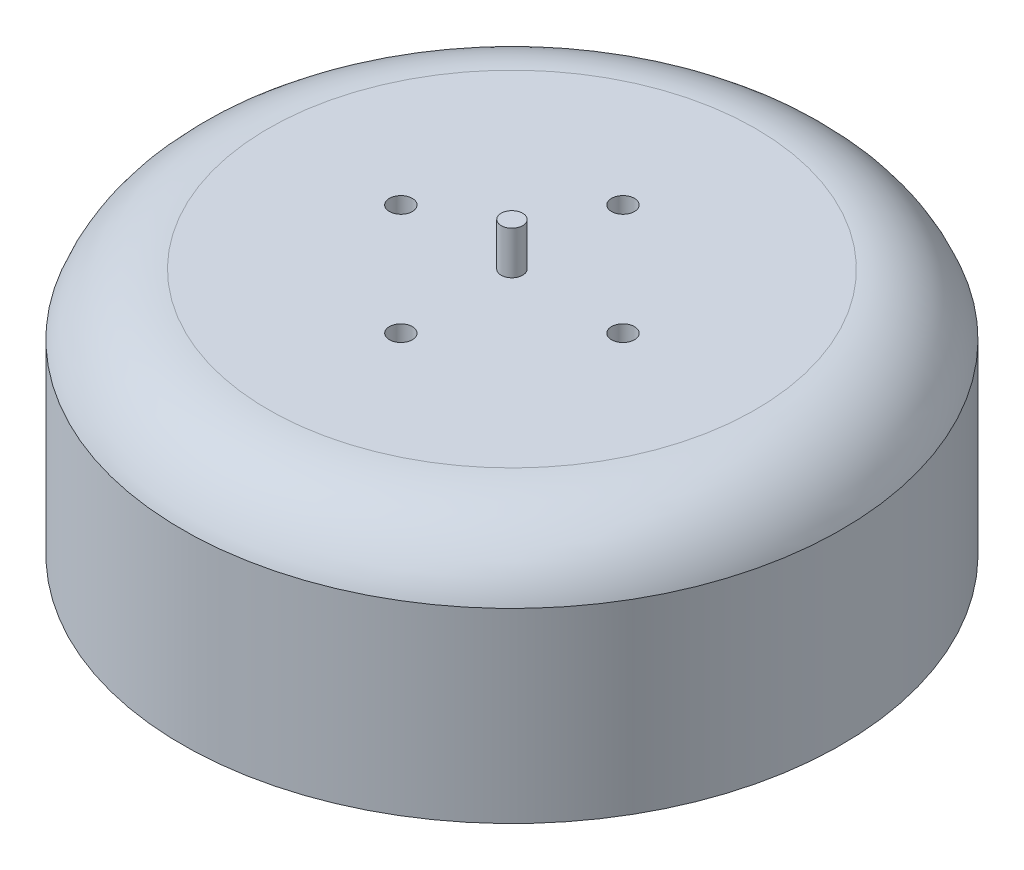
ISO-10303-21;
HEADER;
FILE_DESCRIPTION(('STEP AP214'),'2;1');
FILE_NAME('part.step','',(''),(''),'','','');
FILE_SCHEMA(('AUTOMOTIVE_DESIGN { 1 0 10303 214 1 1 1 1 }'));
ENDSEC;
DATA;
#1=APPLICATION_CONTEXT('core data for automotive mechanical design processes');
#2=APPLICATION_PROTOCOL_DEFINITION('international standard','automotive_design',2000,#1);
#3=PRODUCT_CONTEXT('',#1,'mechanical');
#4=PRODUCT('Part','Part','',(#3));
#5=PRODUCT_RELATED_PRODUCT_CATEGORY('part','',(#4));
#6=PRODUCT_DEFINITION_FORMATION('','',#4);
#7=PRODUCT_DEFINITION_CONTEXT('part definition',#1,'design');
#8=PRODUCT_DEFINITION('design','',#6,#7);
#9=PRODUCT_DEFINITION_SHAPE('','',#8);
#10=(LENGTH_UNIT() NAMED_UNIT(*) SI_UNIT(.MILLI.,.METRE.));
#11=(NAMED_UNIT(*) PLANE_ANGLE_UNIT() SI_UNIT($,.RADIAN.));
#12=(NAMED_UNIT(*) SI_UNIT($,.STERADIAN.) SOLID_ANGLE_UNIT());
#13=UNCERTAINTY_MEASURE_WITH_UNIT(LENGTH_MEASURE(1.E-05),#10,'distance_accuracy_value','');
#14=(GEOMETRIC_REPRESENTATION_CONTEXT(3) GLOBAL_UNCERTAINTY_ASSIGNED_CONTEXT((#13)) GLOBAL_UNIT_ASSIGNED_CONTEXT((#10,
#11,#12)) REPRESENTATION_CONTEXT('',''));
#15=CARTESIAN_POINT('',(0.,0.,0.));
#16=DIRECTION('',(0.,0.,1.));
#17=DIRECTION('',(1.,0.,0.));
#18=AXIS2_PLACEMENT_3D('',#15,#16,#17);
#19=CARTESIAN_POINT('',(0.,25.7794117647059,0.));
#20=DIRECTION('',(0.,-1.,0.));
#21=DIRECTION('',(0.,0.,-1.));
#22=AXIS2_PLACEMENT_3D('',#19,#20,#21);
#23=TOROIDAL_SURFACE('',#22,34.,12.7205882352941);
#24=CARTESIAN_POINT('',(0.,38.5,0.));
#25=DIRECTION('',(0.,-1.,0.));
#26=DIRECTION('',(0.,0.,-1.));
#27=AXIS2_PLACEMENT_3D('',#24,#25,#26);
#28=CIRCLE('',#27,34.);
#29=CARTESIAN_POINT('',(0.,38.5,-34.));
#30=VERTEX_POINT('',#29);
#31=EDGE_CURVE('E53',#30,#30,#28,.T.);
#32=ORIENTED_EDGE('',*,*,#31,.T.);
#33=EDGE_LOOP('',(#32));
#34=FACE_BOUND('',#33,.T.);
#35=CARTESIAN_POINT('',(0.,30.,0.));
#36=DIRECTION('',(0.,-1.,0.));
#37=DIRECTION('',(0.,0.,-1.));
#38=AXIS2_PLACEMENT_3D('',#35,#36,#37);
#39=CIRCLE('',#38,46.);
#40=CARTESIAN_POINT('',(0.,30.,-46.));
#41=VERTEX_POINT('',#40);
#42=EDGE_CURVE('E58',#41,#41,#39,.T.);
#43=ORIENTED_EDGE('',*,*,#42,.F.);
#44=EDGE_LOOP('',(#43));
#45=FACE_BOUND('',#44,.T.);
#46=ADVANCED_FACE('F37',(#34,#45),#23,.T.);
#47=CARTESIAN_POINT('',(34.,38.5,0.));
#48=DIRECTION('',(0.,1.,0.));
#49=DIRECTION('',(0.,0.,1.));
#50=AXIS2_PLACEMENT_3D('',#47,#48,#49);
#51=PLANE('',#50);
#52=CARTESIAN_POINT('',(0.,38.5,-15.5));
#53=DIRECTION('',(0.,1.,0.));
#54=DIRECTION('',(0.,0.,1.));
#55=AXIS2_PLACEMENT_3D('',#52,#53,#54);
#56=CIRCLE('',#55,1.59999999999999);
#57=CARTESIAN_POINT('',(0.,38.5,-13.9));
#58=VERTEX_POINT('',#57);
#59=EDGE_CURVE('E91',#58,#58,#56,.T.);
#60=ORIENTED_EDGE('',*,*,#59,.F.);
#61=EDGE_LOOP('',(#60));
#62=FACE_BOUND('',#61,.T.);
#63=CARTESIAN_POINT('',(-15.5,38.5,0.));
#64=DIRECTION('',(0.,1.,0.));
#65=DIRECTION('',(0.,0.,1.));
#66=AXIS2_PLACEMENT_3D('',#63,#64,#65);
#67=CIRCLE('',#66,1.59999999999999);
#68=CARTESIAN_POINT('',(-15.5,38.5,1.59999999999999));
#69=VERTEX_POINT('',#68);
#70=EDGE_CURVE('E85',#69,#69,#67,.T.);
#71=ORIENTED_EDGE('',*,*,#70,.F.);
#72=EDGE_LOOP('',(#71));
#73=FACE_BOUND('',#72,.T.);
#74=CARTESIAN_POINT('',(15.5,38.5,0.));
#75=DIRECTION('',(0.,1.,0.));
#76=DIRECTION('',(0.,0.,1.));
#77=AXIS2_PLACEMENT_3D('',#74,#75,#76);
#78=CIRCLE('',#77,1.59999999999999);
#79=CARTESIAN_POINT('',(15.5,38.5,1.59999999999999));
#80=VERTEX_POINT('',#79);
#81=EDGE_CURVE('E79',#80,#80,#78,.T.);
#82=ORIENTED_EDGE('',*,*,#81,.F.);
#83=EDGE_LOOP('',(#82));
#84=FACE_BOUND('',#83,.T.);
#85=CARTESIAN_POINT('',(0.,38.5,15.5));
#86=DIRECTION('',(0.,1.,0.));
#87=DIRECTION('',(0.,0.,1.));
#88=AXIS2_PLACEMENT_3D('',#85,#86,#87);
#89=CIRCLE('',#88,1.59999999999999);
#90=CARTESIAN_POINT('',(0.,38.5,17.1));
#91=VERTEX_POINT('',#90);
#92=EDGE_CURVE('E73',#91,#91,#89,.T.);
#93=ORIENTED_EDGE('',*,*,#92,.F.);
#94=EDGE_LOOP('',(#93));
#95=FACE_BOUND('',#94,.T.);
#96=CARTESIAN_POINT('',(0.,38.5,0.));
#97=DIRECTION('',(0.,1.,0.));
#98=DIRECTION('',(0.,0.,1.));
#99=AXIS2_PLACEMENT_3D('',#96,#97,#98);
#100=CIRCLE('',#99,1.5);
#101=CARTESIAN_POINT('',(0.,38.5,1.5));
#102=VERTEX_POINT('',#101);
#103=EDGE_CURVE('E65',#102,#102,#100,.T.);
#104=ORIENTED_EDGE('',*,*,#103,.F.);
#105=EDGE_LOOP('',(#104));
#106=FACE_BOUND('',#105,.T.);
#107=ORIENTED_EDGE('',*,*,#31,.F.);
#108=EDGE_LOOP('',(#107));
#109=FACE_BOUND('',#108,.T.);
#110=ADVANCED_FACE('F125',(#62,#73,#84,#95,#106,#109),#51,.T.);
#111=CARTESIAN_POINT('',(0.,0.,0.));
#112=DIRECTION('',(0.,-1.,0.));
#113=DIRECTION('',(0.,0.,-1.));
#114=AXIS2_PLACEMENT_3D('',#111,#112,#113);
#115=PLANE('',#114);
#116=CARTESIAN_POINT('',(0.,0.,0.));
#117=DIRECTION('',(0.,-1.,0.));
#118=DIRECTION('',(0.,0.,-1.));
#119=AXIS2_PLACEMENT_3D('',#116,#117,#118);
#120=CIRCLE('',#119,27.9999999999997);
#121=CARTESIAN_POINT('',(0.,0.,-27.9999999999997));
#122=VERTEX_POINT('',#121);
#123=EDGE_CURVE('E45',#122,#122,#120,.T.);
#124=ORIENTED_EDGE('',*,*,#123,.T.);
#125=EDGE_LOOP('',(#124));
#126=FACE_BOUND('',#125,.T.);
#127=CARTESIAN_POINT('',(0.,0.,20.));
#128=DIRECTION('',(0.,-1.,0.));
#129=DIRECTION('',(0.,0.,-1.));
#130=AXIS2_PLACEMENT_3D('',#127,#128,#129);
#131=CIRCLE('',#130,2.09999999999999);
#132=CARTESIAN_POINT('',(0.,0.,17.9));
#133=VERTEX_POINT('',#132);
#134=EDGE_CURVE('E115',#133,#133,#131,.T.);
#135=ORIENTED_EDGE('',*,*,#134,.F.);
#136=EDGE_LOOP('',(#135));
#137=FACE_BOUND('',#136,.T.);
#138=CARTESIAN_POINT('',(-20.,0.,0.));
#139=DIRECTION('',(0.,-1.,0.));
#140=DIRECTION('',(0.,0.,-1.));
#141=AXIS2_PLACEMENT_3D('',#138,#139,#140);
#142=CIRCLE('',#141,2.09999999999999);
#143=CARTESIAN_POINT('',(-20.,0.,-2.09999999999999));
#144=VERTEX_POINT('',#143);
#145=EDGE_CURVE('E109',#144,#144,#142,.T.);
#146=ORIENTED_EDGE('',*,*,#145,.F.);
#147=EDGE_LOOP('',(#146));
#148=FACE_BOUND('',#147,.T.);
#149=CARTESIAN_POINT('',(20.,0.,0.));
#150=DIRECTION('',(0.,-1.,0.));
#151=DIRECTION('',(0.,0.,-1.));
#152=AXIS2_PLACEMENT_3D('',#149,#150,#151);
#153=CIRCLE('',#152,2.09999999999999);
#154=CARTESIAN_POINT('',(20.,0.,-2.09999999999999));
#155=VERTEX_POINT('',#154);
#156=EDGE_CURVE('E103',#155,#155,#153,.T.);
#157=ORIENTED_EDGE('',*,*,#156,.F.);
#158=EDGE_LOOP('',(#157));
#159=FACE_BOUND('',#158,.T.);
#160=CARTESIAN_POINT('',(0.,0.,-20.));
#161=DIRECTION('',(0.,-1.,0.));
#162=DIRECTION('',(0.,0.,-1.));
#163=AXIS2_PLACEMENT_3D('',#160,#161,#162);
#164=CIRCLE('',#163,2.09999999999999);
#165=CARTESIAN_POINT('',(0.,0.,-22.1));
#166=VERTEX_POINT('',#165);
#167=EDGE_CURVE('E97',#166,#166,#164,.T.);
#168=ORIENTED_EDGE('',*,*,#167,.F.);
#169=EDGE_LOOP('',(#168));
#170=FACE_BOUND('',#169,.T.);
#171=CARTESIAN_POINT('',(0.,0.,0.));
#172=DIRECTION('',(0.,-1.,0.));
#173=DIRECTION('',(0.,0.,-1.));
#174=AXIS2_PLACEMENT_3D('',#171,#172,#173);
#175=CIRCLE('',#174,7.);
#176=CARTESIAN_POINT('',(0.,0.,-7.));
#177=VERTEX_POINT('',#176);
#178=EDGE_CURVE('E49',#177,#177,#175,.T.);
#179=ORIENTED_EDGE('',*,*,#178,.F.);
#180=EDGE_LOOP('',(#179));
#181=FACE_BOUND('',#180,.T.);
#182=ADVANCED_FACE('F121',(#126,#137,#148,#159,#170,#181),#115,.T.);
#183=CARTESIAN_POINT('',(0.,38.5,0.));
#184=DIRECTION('',(0.,-1.,0.));
#185=DIRECTION('',(0.,0.,-1.));
#186=AXIS2_PLACEMENT_3D('',#183,#184,#185);
#187=CYLINDRICAL_SURFACE('',#186,46.);
#188=CARTESIAN_POINT('',(0.,3.99999999999989,0.));
#189=DIRECTION('',(0.,-1.,0.));
#190=DIRECTION('',(0.,0.,-1.));
#191=AXIS2_PLACEMENT_3D('',#188,#189,#190);
#192=CIRCLE('',#191,46.);
#193=CARTESIAN_POINT('',(0.,3.99999999999989,-46.));
#194=VERTEX_POINT('',#193);
#195=EDGE_CURVE('E10',#194,#194,#192,.F.);
#196=ORIENTED_EDGE('',*,*,#195,.T.);
#197=EDGE_LOOP('',(#196));
#198=FACE_BOUND('',#197,.T.);
#199=ORIENTED_EDGE('',*,*,#42,.T.);
#200=EDGE_LOOP('',(#199));
#201=FACE_BOUND('',#200,.T.);
#202=ADVANCED_FACE('F124',(#198,#201),#187,.T.);
#203=CARTESIAN_POINT('',(0.,-3.,0.));
#204=DIRECTION('',(0.,1.,0.));
#205=DIRECTION('',(0.,0.,1.));
#206=AXIS2_PLACEMENT_3D('',#203,#204,#205);
#207=CYLINDRICAL_SURFACE('',#206,7.);
#208=CARTESIAN_POINT('',(0.,-3.,0.));
#209=DIRECTION('',(0.,-1.,0.));
#210=DIRECTION('',(0.,0.,-1.));
#211=AXIS2_PLACEMENT_3D('',#208,#209,#210);
#212=CIRCLE('',#211,7.);
#213=CARTESIAN_POINT('',(0.,-3.,-7.));
#214=VERTEX_POINT('',#213);
#215=EDGE_CURVE('E60',#214,#214,#212,.T.);
#216=ORIENTED_EDGE('',*,*,#215,.F.);
#217=EDGE_LOOP('',(#216));
#218=FACE_BOUND('',#217,.T.);
#219=ORIENTED_EDGE('',*,*,#178,.T.);
#220=EDGE_LOOP('',(#219));
#221=FACE_BOUND('',#220,.T.);
#222=ADVANCED_FACE('F135',(#218,#221),#207,.T.);
#223=CARTESIAN_POINT('',(0.,-3.,0.));
#224=DIRECTION('',(0.,-1.,0.));
#225=DIRECTION('',(0.,0.,-1.));
#226=AXIS2_PLACEMENT_3D('',#223,#224,#225);
#227=PLANE('',#226);
#228=ORIENTED_EDGE('',*,*,#215,.T.);
#229=EDGE_LOOP('',(#228));
#230=FACE_BOUND('',#229,.T.);
#231=ADVANCED_FACE('F137',(#230),#227,.T.);
#232=CARTESIAN_POINT('',(0.,44.5,0.));
#233=DIRECTION('',(0.,-1.,0.));
#234=DIRECTION('',(0.,0.,-1.));
#235=AXIS2_PLACEMENT_3D('',#232,#233,#234);
#236=CYLINDRICAL_SURFACE('',#235,1.5);
#237=CARTESIAN_POINT('',(0.,44.5,0.));
#238=DIRECTION('',(0.,1.,0.));
#239=DIRECTION('',(0.,0.,1.));
#240=AXIS2_PLACEMENT_3D('',#237,#238,#239);
#241=CIRCLE('',#240,1.5);
#242=CARTESIAN_POINT('',(0.,44.5,1.5));
#243=VERTEX_POINT('',#242);
#244=EDGE_CURVE('E64',#243,#243,#241,.T.);
#245=ORIENTED_EDGE('',*,*,#244,.F.);
#246=EDGE_LOOP('',(#245));
#247=FACE_BOUND('',#246,.T.);
#248=ORIENTED_EDGE('',*,*,#103,.T.);
#249=EDGE_LOOP('',(#248));
#250=FACE_BOUND('',#249,.T.);
#251=ADVANCED_FACE('F144',(#247,#250),#236,.T.);
#252=CARTESIAN_POINT('',(0.,44.5,0.));
#253=DIRECTION('',(0.,1.,0.));
#254=DIRECTION('',(0.,0.,1.));
#255=AXIS2_PLACEMENT_3D('',#252,#253,#254);
#256=PLANE('',#255);
#257=ORIENTED_EDGE('',*,*,#244,.T.);
#258=EDGE_LOOP('',(#257));
#259=FACE_BOUND('',#258,.T.);
#260=ADVANCED_FACE('F174',(#259),#256,.T.);
#261=CARTESIAN_POINT('',(0.,28.5,15.5));
#262=DIRECTION('',(0.,-1.,0.));
#263=DIRECTION('',(0.,0.,-1.));
#264=AXIS2_PLACEMENT_3D('',#261,#262,#263);
#265=PLANE('',#264);
#266=CARTESIAN_POINT('',(0.,28.5,15.5));
#267=DIRECTION('',(0.,1.,0.));
#268=DIRECTION('',(0.,0.,1.));
#269=AXIS2_PLACEMENT_3D('',#266,#267,#268);
#270=CIRCLE('',#269,1.59999999999999);
#271=CARTESIAN_POINT('',(0.,28.5,17.1));
#272=VERTEX_POINT('',#271);
#273=EDGE_CURVE('E68',#272,#272,#270,.T.);
#274=ORIENTED_EDGE('',*,*,#273,.T.);
#275=EDGE_LOOP('',(#274));
#276=FACE_BOUND('',#275,.T.);
#277=ADVANCED_FACE('F180',(#276),#265,.F.);
#278=CARTESIAN_POINT('',(0.,38.5,15.5));
#279=DIRECTION('',(0.,1.,0.));
#280=DIRECTION('',(0.,0.,1.));
#281=AXIS2_PLACEMENT_3D('',#278,#279,#280);
#282=CYLINDRICAL_SURFACE('',#281,1.59999999999999);
#283=ORIENTED_EDGE('',*,*,#273,.F.);
#284=EDGE_LOOP('',(#283));
#285=FACE_BOUND('',#284,.T.);
#286=ORIENTED_EDGE('',*,*,#92,.T.);
#287=EDGE_LOOP('',(#286));
#288=FACE_BOUND('',#287,.T.);
#289=ADVANCED_FACE('F187',(#285,#288),#282,.F.);
#290=CARTESIAN_POINT('',(15.5,28.5,0.));
#291=DIRECTION('',(0.,-1.,0.));
#292=DIRECTION('',(0.,0.,-1.));
#293=AXIS2_PLACEMENT_3D('',#290,#291,#292);
#294=PLANE('',#293);
#295=CARTESIAN_POINT('',(15.5,28.5,0.));
#296=DIRECTION('',(0.,1.,0.));
#297=DIRECTION('',(0.,0.,1.));
#298=AXIS2_PLACEMENT_3D('',#295,#296,#297);
#299=CIRCLE('',#298,1.59999999999999);
#300=CARTESIAN_POINT('',(15.5,28.5,1.59999999999999));
#301=VERTEX_POINT('',#300);
#302=EDGE_CURVE('E76',#301,#301,#299,.T.);
#303=ORIENTED_EDGE('',*,*,#302,.T.);
#304=EDGE_LOOP('',(#303));
#305=FACE_BOUND('',#304,.T.);
#306=ADVANCED_FACE('F191',(#305),#294,.F.);
#307=CARTESIAN_POINT('',(15.5,38.5,0.));
#308=DIRECTION('',(0.,1.,0.));
#309=DIRECTION('',(0.,0.,1.));
#310=AXIS2_PLACEMENT_3D('',#307,#308,#309);
#311=CYLINDRICAL_SURFACE('',#310,1.59999999999999);
#312=ORIENTED_EDGE('',*,*,#302,.F.);
#313=EDGE_LOOP('',(#312));
#314=FACE_BOUND('',#313,.T.);
#315=ORIENTED_EDGE('',*,*,#81,.T.);
#316=EDGE_LOOP('',(#315));
#317=FACE_BOUND('',#316,.T.);
#318=ADVANCED_FACE('F195',(#314,#317),#311,.F.);
#319=CARTESIAN_POINT('',(-15.5,28.5,0.));
#320=DIRECTION('',(0.,-1.,0.));
#321=DIRECTION('',(0.,0.,-1.));
#322=AXIS2_PLACEMENT_3D('',#319,#320,#321);
#323=PLANE('',#322);
#324=CARTESIAN_POINT('',(-15.5,28.5,0.));
#325=DIRECTION('',(0.,1.,0.));
#326=DIRECTION('',(0.,0.,1.));
#327=AXIS2_PLACEMENT_3D('',#324,#325,#326);
#328=CIRCLE('',#327,1.59999999999999);
#329=CARTESIAN_POINT('',(-15.5,28.5,1.59999999999999));
#330=VERTEX_POINT('',#329);
#331=EDGE_CURVE('E82',#330,#330,#328,.T.);
#332=ORIENTED_EDGE('',*,*,#331,.T.);
#333=EDGE_LOOP('',(#332));
#334=FACE_BOUND('',#333,.T.);
#335=ADVANCED_FACE('F199',(#334),#323,.F.);
#336=CARTESIAN_POINT('',(-15.5,38.5,0.));
#337=DIRECTION('',(0.,1.,0.));
#338=DIRECTION('',(0.,0.,1.));
#339=AXIS2_PLACEMENT_3D('',#336,#337,#338);
#340=CYLINDRICAL_SURFACE('',#339,1.59999999999999);
#341=ORIENTED_EDGE('',*,*,#331,.F.);
#342=EDGE_LOOP('',(#341));
#343=FACE_BOUND('',#342,.T.);
#344=ORIENTED_EDGE('',*,*,#70,.T.);
#345=EDGE_LOOP('',(#344));
#346=FACE_BOUND('',#345,.T.);
#347=ADVANCED_FACE('F203',(#343,#346),#340,.F.);
#348=CARTESIAN_POINT('',(0.,28.5,-15.5));
#349=DIRECTION('',(0.,-1.,0.));
#350=DIRECTION('',(0.,0.,-1.));
#351=AXIS2_PLACEMENT_3D('',#348,#349,#350);
#352=PLANE('',#351);
#353=CARTESIAN_POINT('',(0.,28.5,-15.5));
#354=DIRECTION('',(0.,1.,0.));
#355=DIRECTION('',(0.,0.,1.));
#356=AXIS2_PLACEMENT_3D('',#353,#354,#355);
#357=CIRCLE('',#356,1.59999999999999);
#358=CARTESIAN_POINT('',(0.,28.5,-13.9));
#359=VERTEX_POINT('',#358);
#360=EDGE_CURVE('E88',#359,#359,#357,.T.);
#361=ORIENTED_EDGE('',*,*,#360,.T.);
#362=EDGE_LOOP('',(#361));
#363=FACE_BOUND('',#362,.T.);
#364=ADVANCED_FACE('F207',(#363),#352,.F.);
#365=CARTESIAN_POINT('',(0.,38.5,-15.5));
#366=DIRECTION('',(0.,1.,0.));
#367=DIRECTION('',(0.,0.,1.));
#368=AXIS2_PLACEMENT_3D('',#365,#366,#367);
#369=CYLINDRICAL_SURFACE('',#368,1.59999999999999);
#370=ORIENTED_EDGE('',*,*,#360,.F.);
#371=EDGE_LOOP('',(#370));
#372=FACE_BOUND('',#371,.T.);
#373=ORIENTED_EDGE('',*,*,#59,.T.);
#374=EDGE_LOOP('',(#373));
#375=FACE_BOUND('',#374,.T.);
#376=ADVANCED_FACE('F211',(#372,#375),#369,.F.);
#377=CARTESIAN_POINT('',(0.,12.,-20.));
#378=DIRECTION('',(0.,1.,0.));
#379=DIRECTION('',(0.,0.,1.));
#380=AXIS2_PLACEMENT_3D('',#377,#378,#379);
#381=PLANE('',#380);
#382=CARTESIAN_POINT('',(0.,12.,-20.));
#383=DIRECTION('',(0.,-1.,0.));
#384=DIRECTION('',(0.,0.,-1.));
#385=AXIS2_PLACEMENT_3D('',#382,#383,#384);
#386=CIRCLE('',#385,2.09999999999999);
#387=CARTESIAN_POINT('',(0.,12.,-22.1));
#388=VERTEX_POINT('',#387);
#389=EDGE_CURVE('E94',#388,#388,#386,.T.);
#390=ORIENTED_EDGE('',*,*,#389,.T.);
#391=EDGE_LOOP('',(#390));
#392=FACE_BOUND('',#391,.T.);
#393=ADVANCED_FACE('F215',(#392),#381,.F.);
#394=CARTESIAN_POINT('',(0.,0.,-20.));
#395=DIRECTION('',(0.,-1.,0.));
#396=DIRECTION('',(0.,0.,-1.));
#397=AXIS2_PLACEMENT_3D('',#394,#395,#396);
#398=CYLINDRICAL_SURFACE('',#397,2.09999999999999);
#399=ORIENTED_EDGE('',*,*,#389,.F.);
#400=EDGE_LOOP('',(#399));
#401=FACE_BOUND('',#400,.T.);
#402=ORIENTED_EDGE('',*,*,#167,.T.);
#403=EDGE_LOOP('',(#402));
#404=FACE_BOUND('',#403,.T.);
#405=ADVANCED_FACE('F219',(#401,#404),#398,.F.);
#406=CARTESIAN_POINT('',(20.,12.,0.));
#407=DIRECTION('',(0.,1.,0.));
#408=DIRECTION('',(0.,0.,1.));
#409=AXIS2_PLACEMENT_3D('',#406,#407,#408);
#410=PLANE('',#409);
#411=CARTESIAN_POINT('',(20.,12.,0.));
#412=DIRECTION('',(0.,-1.,0.));
#413=DIRECTION('',(0.,0.,-1.));
#414=AXIS2_PLACEMENT_3D('',#411,#412,#413);
#415=CIRCLE('',#414,2.09999999999999);
#416=CARTESIAN_POINT('',(20.,12.,-2.09999999999999));
#417=VERTEX_POINT('',#416);
#418=EDGE_CURVE('E100',#417,#417,#415,.T.);
#419=ORIENTED_EDGE('',*,*,#418,.T.);
#420=EDGE_LOOP('',(#419));
#421=FACE_BOUND('',#420,.T.);
#422=ADVANCED_FACE('F223',(#421),#410,.F.);
#423=CARTESIAN_POINT('',(20.,0.,0.));
#424=DIRECTION('',(0.,-1.,0.));
#425=DIRECTION('',(0.,0.,-1.));
#426=AXIS2_PLACEMENT_3D('',#423,#424,#425);
#427=CYLINDRICAL_SURFACE('',#426,2.09999999999999);
#428=ORIENTED_EDGE('',*,*,#418,.F.);
#429=EDGE_LOOP('',(#428));
#430=FACE_BOUND('',#429,.T.);
#431=ORIENTED_EDGE('',*,*,#156,.T.);
#432=EDGE_LOOP('',(#431));
#433=FACE_BOUND('',#432,.T.);
#434=ADVANCED_FACE('F227',(#430,#433),#427,.F.);
#435=CARTESIAN_POINT('',(-20.,12.,0.));
#436=DIRECTION('',(0.,1.,0.));
#437=DIRECTION('',(0.,0.,1.));
#438=AXIS2_PLACEMENT_3D('',#435,#436,#437);
#439=PLANE('',#438);
#440=CARTESIAN_POINT('',(-20.,12.,0.));
#441=DIRECTION('',(0.,-1.,0.));
#442=DIRECTION('',(0.,0.,-1.));
#443=AXIS2_PLACEMENT_3D('',#440,#441,#442);
#444=CIRCLE('',#443,2.09999999999999);
#445=CARTESIAN_POINT('',(-20.,12.,-2.09999999999999));
#446=VERTEX_POINT('',#445);
#447=EDGE_CURVE('E106',#446,#446,#444,.T.);
#448=ORIENTED_EDGE('',*,*,#447,.T.);
#449=EDGE_LOOP('',(#448));
#450=FACE_BOUND('',#449,.T.);
#451=ADVANCED_FACE('F231',(#450),#439,.F.);
#452=CARTESIAN_POINT('',(-20.,0.,0.));
#453=DIRECTION('',(0.,-1.,0.));
#454=DIRECTION('',(0.,0.,-1.));
#455=AXIS2_PLACEMENT_3D('',#452,#453,#454);
#456=CYLINDRICAL_SURFACE('',#455,2.09999999999999);
#457=ORIENTED_EDGE('',*,*,#447,.F.);
#458=EDGE_LOOP('',(#457));
#459=FACE_BOUND('',#458,.T.);
#460=ORIENTED_EDGE('',*,*,#145,.T.);
#461=EDGE_LOOP('',(#460));
#462=FACE_BOUND('',#461,.T.);
#463=ADVANCED_FACE('F235',(#459,#462),#456,.F.);
#464=CARTESIAN_POINT('',(0.,12.,20.));
#465=DIRECTION('',(0.,1.,0.));
#466=DIRECTION('',(0.,0.,1.));
#467=AXIS2_PLACEMENT_3D('',#464,#465,#466);
#468=PLANE('',#467);
#469=CARTESIAN_POINT('',(0.,12.,20.));
#470=DIRECTION('',(0.,-1.,0.));
#471=DIRECTION('',(0.,0.,-1.));
#472=AXIS2_PLACEMENT_3D('',#469,#470,#471);
#473=CIRCLE('',#472,2.09999999999999);
#474=CARTESIAN_POINT('',(0.,12.,17.9));
#475=VERTEX_POINT('',#474);
#476=EDGE_CURVE('E112',#475,#475,#473,.T.);
#477=ORIENTED_EDGE('',*,*,#476,.T.);
#478=EDGE_LOOP('',(#477));
#479=FACE_BOUND('',#478,.T.);
#480=ADVANCED_FACE('F239',(#479),#468,.F.);
#481=CARTESIAN_POINT('',(0.,0.,20.));
#482=DIRECTION('',(0.,-1.,0.));
#483=DIRECTION('',(0.,0.,-1.));
#484=AXIS2_PLACEMENT_3D('',#481,#482,#483);
#485=CYLINDRICAL_SURFACE('',#484,2.09999999999999);
#486=ORIENTED_EDGE('',*,*,#476,.F.);
#487=EDGE_LOOP('',(#486));
#488=FACE_BOUND('',#487,.T.);
#489=ORIENTED_EDGE('',*,*,#134,.T.);
#490=EDGE_LOOP('',(#489));
#491=FACE_BOUND('',#490,.T.);
#492=ADVANCED_FACE('F119',(#488,#491),#485,.F.);
#493=CARTESIAN_POINT('',(0.,0.,0.));
#494=DIRECTION('',(0.,1.,0.));
#495=DIRECTION('',(0.,0.,1.));
#496=AXIS2_PLACEMENT_3D('',#493,#494,#495);
#497=CONICAL_SURFACE('',#496,27.9999999999997,1.35212738092096);
#498=ORIENTED_EDGE('',*,*,#195,.F.);
#499=EDGE_LOOP('',(#498));
#500=FACE_BOUND('',#499,.T.);
#501=ORIENTED_EDGE('',*,*,#123,.F.);
#502=EDGE_LOOP('',(#501));
#503=FACE_BOUND('',#502,.T.);
#504=ADVANCED_FACE('F40',(#500,#503),#497,.T.);
#505=CLOSED_SHELL('',(#46,#110,#182,#202,#222,#231,#251,#260,#277,#289,#306,#318,#335,#347,#364,
#376,#393,#405,#422,#434,#451,#463,#480,#492,#504));
#506=MANIFOLD_SOLID_BREP('B2',#505);
#507=ADVANCED_BREP_SHAPE_REPRESENTATION('',(#18,#506),#14);
#508=SHAPE_DEFINITION_REPRESENTATION(#9,#507);
ENDSEC;
END-ISO-10303-21;
